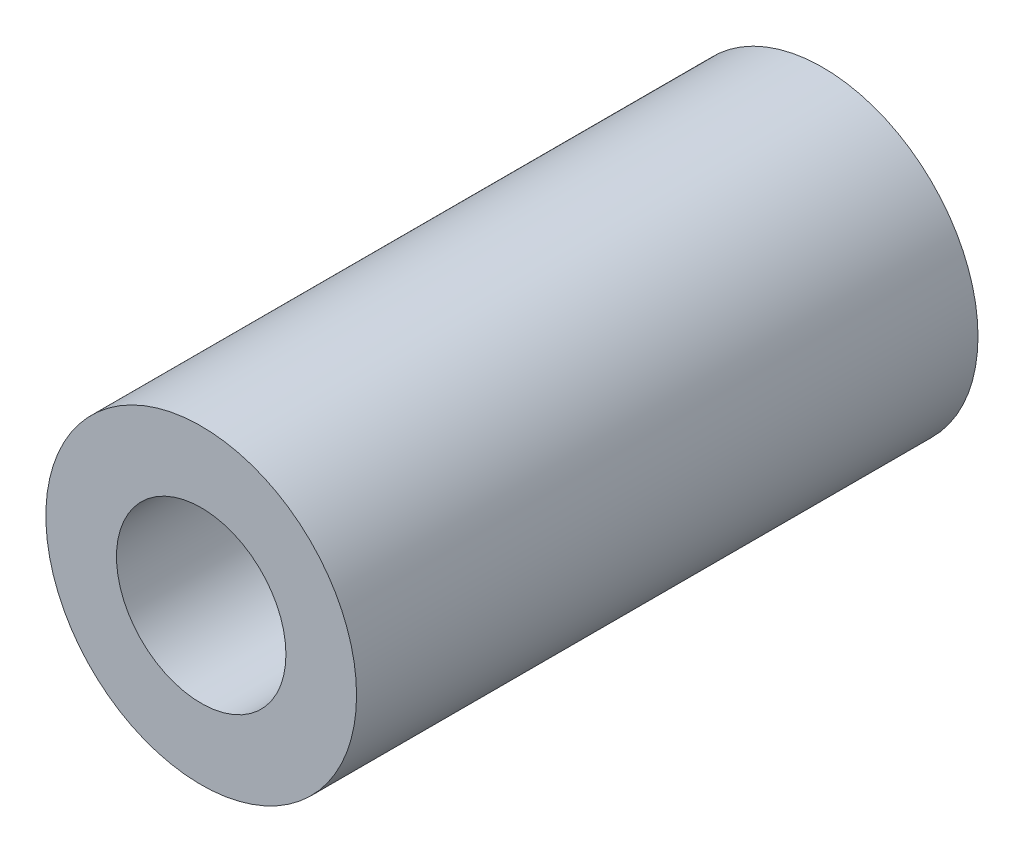
ISO-10303-21;
HEADER;
FILE_DESCRIPTION(('STEP AP214'),'2;1');
FILE_NAME('part.step','',(''),(''),'','','');
FILE_SCHEMA(('AUTOMOTIVE_DESIGN { 1 0 10303 214 1 1 1 1 }'));
ENDSEC;
DATA;
#1=APPLICATION_CONTEXT('core data for automotive mechanical design processes');
#2=APPLICATION_PROTOCOL_DEFINITION('international standard','automotive_design',2000,#1);
#3=PRODUCT_CONTEXT('',#1,'mechanical');
#4=PRODUCT('Part','Part','',(#3));
#5=PRODUCT_RELATED_PRODUCT_CATEGORY('part','',(#4));
#6=PRODUCT_DEFINITION_FORMATION('','',#4);
#7=PRODUCT_DEFINITION_CONTEXT('part definition',#1,'design');
#8=PRODUCT_DEFINITION('design','',#6,#7);
#9=PRODUCT_DEFINITION_SHAPE('','',#8);
#10=(LENGTH_UNIT() NAMED_UNIT(*) SI_UNIT(.MILLI.,.METRE.));
#11=(NAMED_UNIT(*) PLANE_ANGLE_UNIT() SI_UNIT($,.RADIAN.));
#12=(NAMED_UNIT(*) SI_UNIT($,.STERADIAN.) SOLID_ANGLE_UNIT());
#13=UNCERTAINTY_MEASURE_WITH_UNIT(LENGTH_MEASURE(1.E-05),#10,'distance_accuracy_value','');
#14=(GEOMETRIC_REPRESENTATION_CONTEXT(3) GLOBAL_UNCERTAINTY_ASSIGNED_CONTEXT((#13)) GLOBAL_UNIT_ASSIGNED_CONTEXT((#10,
#11,#12)) REPRESENTATION_CONTEXT('',''));
#15=CARTESIAN_POINT('',(0.,0.,0.));
#16=DIRECTION('',(0.,0.,1.));
#17=DIRECTION('',(1.,0.,0.));
#18=AXIS2_PLACEMENT_3D('',#15,#16,#17);
#19=CARTESIAN_POINT('',(0.,0.,11.));
#20=DIRECTION('',(0.,0.,1.));
#21=DIRECTION('',(1.,0.,0.));
#22=AXIS2_PLACEMENT_3D('',#19,#20,#21);
#23=PLANE('',#22);
#24=CARTESIAN_POINT('',(0.,0.,11.));
#25=DIRECTION('',(0.,0.,1.));
#26=DIRECTION('',(1.,0.,0.));
#27=AXIS2_PLACEMENT_3D('',#24,#25,#26);
#28=CIRCLE('',#27,2.75);
#29=CARTESIAN_POINT('',(2.75,0.,11.));
#30=VERTEX_POINT('',#29);
#31=EDGE_CURVE('E10',#30,#30,#28,.T.);
#32=ORIENTED_EDGE('',*,*,#31,.T.);
#33=EDGE_LOOP('',(#32));
#34=FACE_BOUND('',#33,.T.);
#35=CARTESIAN_POINT('',(0.,0.,11.));
#36=DIRECTION('',(0.,0.,1.));
#37=DIRECTION('',(1.,0.,0.));
#38=AXIS2_PLACEMENT_3D('',#35,#36,#37);
#39=CIRCLE('',#38,1.5);
#40=CARTESIAN_POINT('',(1.5,0.,11.));
#41=VERTEX_POINT('',#40);
#42=EDGE_CURVE('E42',#41,#41,#39,.T.);
#43=ORIENTED_EDGE('',*,*,#42,.F.);
#44=EDGE_LOOP('',(#43));
#45=FACE_BOUND('',#44,.T.);
#46=ADVANCED_FACE('F31',(#34,#45),#23,.T.);
#47=CARTESIAN_POINT('',(0.,0.,0.));
#48=DIRECTION('',(0.,0.,1.));
#49=DIRECTION('',(1.,0.,0.));
#50=AXIS2_PLACEMENT_3D('',#47,#48,#49);
#51=PLANE('',#50);
#52=CARTESIAN_POINT('',(0.,0.,0.));
#53=DIRECTION('',(0.,0.,1.));
#54=DIRECTION('',(1.,0.,0.));
#55=AXIS2_PLACEMENT_3D('',#52,#53,#54);
#56=CIRCLE('',#55,2.75);
#57=CARTESIAN_POINT('',(2.75,0.,0.));
#58=VERTEX_POINT('',#57);
#59=EDGE_CURVE('E35',#58,#58,#56,.T.);
#60=ORIENTED_EDGE('',*,*,#59,.F.);
#61=EDGE_LOOP('',(#60));
#62=FACE_BOUND('',#61,.T.);
#63=CARTESIAN_POINT('',(0.,0.,0.));
#64=DIRECTION('',(0.,0.,1.));
#65=DIRECTION('',(1.,0.,0.));
#66=AXIS2_PLACEMENT_3D('',#63,#64,#65);
#67=CIRCLE('',#66,1.5);
#68=CARTESIAN_POINT('',(1.5,0.,0.));
#69=VERTEX_POINT('',#68);
#70=EDGE_CURVE('E44',#69,#69,#67,.T.);
#71=ORIENTED_EDGE('',*,*,#70,.T.);
#72=EDGE_LOOP('',(#71));
#73=FACE_BOUND('',#72,.T.);
#74=ADVANCED_FACE('F54',(#62,#73),#51,.F.);
#75=CARTESIAN_POINT('',(0.,0.,11.));
#76=DIRECTION('',(0.,0.,-1.));
#77=DIRECTION('',(-1.,0.,0.));
#78=AXIS2_PLACEMENT_3D('',#75,#76,#77);
#79=CYLINDRICAL_SURFACE('',#78,2.75);
#80=ORIENTED_EDGE('',*,*,#31,.F.);
#81=EDGE_LOOP('',(#80));
#82=FACE_BOUND('',#81,.T.);
#83=ORIENTED_EDGE('',*,*,#59,.T.);
#84=EDGE_LOOP('',(#83));
#85=FACE_BOUND('',#84,.T.);
#86=ADVANCED_FACE('F33',(#82,#85),#79,.T.);
#87=CARTESIAN_POINT('',(0.,0.,11.));
#88=DIRECTION('',(0.,0.,-1.));
#89=DIRECTION('',(-1.,0.,0.));
#90=AXIS2_PLACEMENT_3D('',#87,#88,#89);
#91=CYLINDRICAL_SURFACE('',#90,1.5);
#92=ORIENTED_EDGE('',*,*,#42,.T.);
#93=EDGE_LOOP('',(#92));
#94=FACE_BOUND('',#93,.T.);
#95=ORIENTED_EDGE('',*,*,#70,.F.);
#96=EDGE_LOOP('',(#95));
#97=FACE_BOUND('',#96,.T.);
#98=ADVANCED_FACE('F50',(#94,#97),#91,.F.);
#99=CLOSED_SHELL('',(#46,#74,#86,#98));
#100=MANIFOLD_SOLID_BREP('B2',#99);
#101=ADVANCED_BREP_SHAPE_REPRESENTATION('',(#18,#100),#14);
#102=SHAPE_DEFINITION_REPRESENTATION(#9,#101);
ENDSEC;
END-ISO-10303-21;
